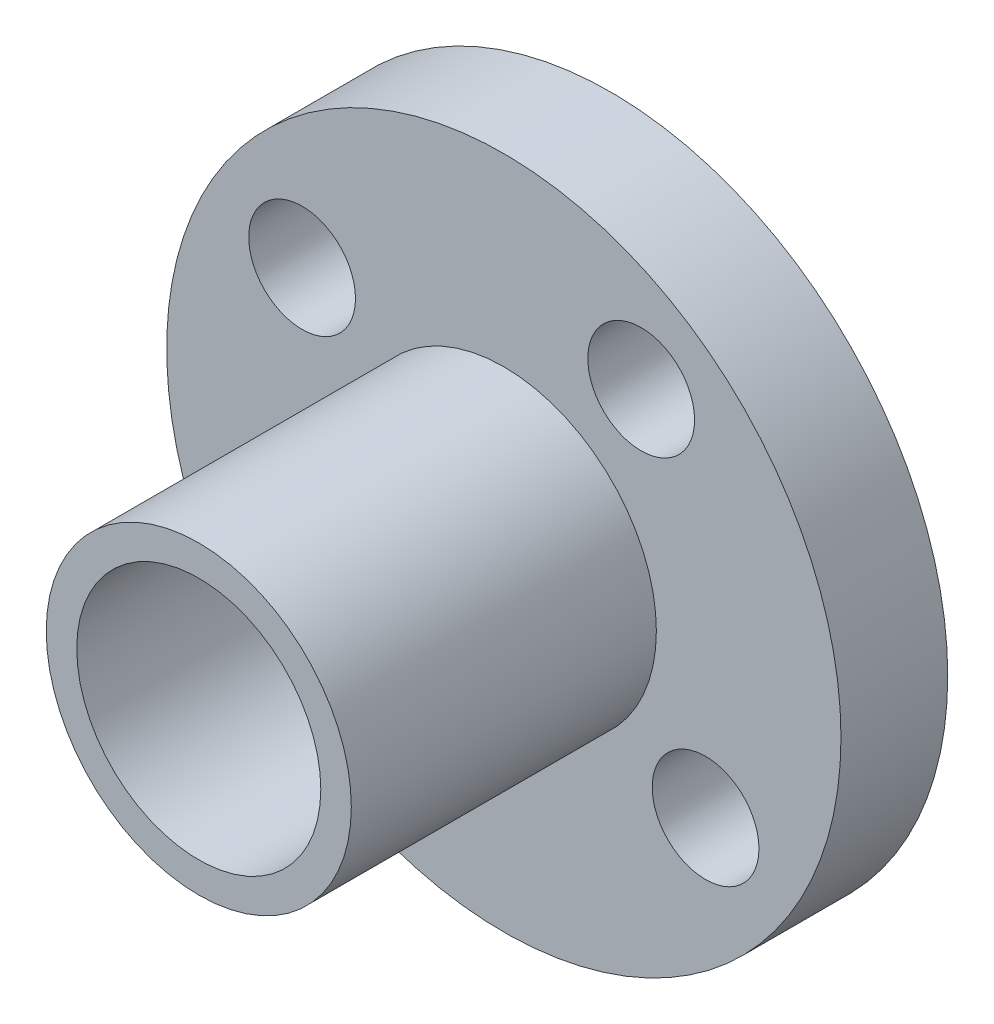
ISO-10303-21;
HEADER;
FILE_DESCRIPTION(('STEP AP214'),'2;1');
FILE_NAME('part.step','',(''),(''),'','','');
FILE_SCHEMA(('AUTOMOTIVE_DESIGN { 1 0 10303 214 1 1 1 1 }'));
ENDSEC;
DATA;
#1=APPLICATION_CONTEXT('core data for automotive mechanical design processes');
#2=APPLICATION_PROTOCOL_DEFINITION('international standard','automotive_design',2000,#1);
#3=PRODUCT_CONTEXT('',#1,'mechanical');
#4=PRODUCT('Part','Part','',(#3));
#5=PRODUCT_RELATED_PRODUCT_CATEGORY('part','',(#4));
#6=PRODUCT_DEFINITION_FORMATION('','',#4);
#7=PRODUCT_DEFINITION_CONTEXT('part definition',#1,'design');
#8=PRODUCT_DEFINITION('design','',#6,#7);
#9=PRODUCT_DEFINITION_SHAPE('','',#8);
#10=(LENGTH_UNIT() NAMED_UNIT(*) SI_UNIT(.MILLI.,.METRE.));
#11=(NAMED_UNIT(*) PLANE_ANGLE_UNIT() SI_UNIT($,.RADIAN.));
#12=(NAMED_UNIT(*) SI_UNIT($,.STERADIAN.) SOLID_ANGLE_UNIT());
#13=UNCERTAINTY_MEASURE_WITH_UNIT(LENGTH_MEASURE(1.E-05),#10,'distance_accuracy_value','');
#14=(GEOMETRIC_REPRESENTATION_CONTEXT(3) GLOBAL_UNCERTAINTY_ASSIGNED_CONTEXT((#13)) GLOBAL_UNIT_ASSIGNED_CONTEXT((#10,
#11,#12)) REPRESENTATION_CONTEXT('',''));
#15=CARTESIAN_POINT('',(0.,0.,0.));
#16=DIRECTION('',(0.,0.,1.));
#17=DIRECTION('',(1.,0.,0.));
#18=AXIS2_PLACEMENT_3D('',#15,#16,#17);
#19=CARTESIAN_POINT('',(-4.50200039763769,-6.61301689243798,3.5));
#20=DIRECTION('',(0.,0.,-1.));
#21=DIRECTION('',(-1.,0.,0.));
#22=AXIS2_PLACEMENT_3D('',#19,#20,#21);
#23=CYLINDRICAL_SURFACE('',#22,1.75);
#24=CARTESIAN_POINT('',(-4.50200039763769,-6.61301689243798,3.5));
#25=DIRECTION('',(0.,0.,1.));
#26=DIRECTION('',(1.,0.,0.));
#27=AXIS2_PLACEMENT_3D('',#24,#25,#26);
#28=CIRCLE('',#27,1.75);
#29=CARTESIAN_POINT('',(-2.75200039763769,-6.61301689243798,3.5));
#30=VERTEX_POINT('',#29);
#31=EDGE_CURVE('E44',#30,#30,#28,.T.);
#32=ORIENTED_EDGE('',*,*,#31,.T.);
#33=EDGE_LOOP('',(#32));
#34=FACE_BOUND('',#33,.T.);
#35=CARTESIAN_POINT('',(-4.50200039763769,-6.61301689243798,0.));
#36=DIRECTION('',(0.,0.,1.));
#37=DIRECTION('',(1.,0.,0.));
#38=AXIS2_PLACEMENT_3D('',#35,#36,#37);
#39=CIRCLE('',#38,1.75);
#40=CARTESIAN_POINT('',(-2.75200039763769,-6.61301689243798,0.));
#41=VERTEX_POINT('',#40);
#42=EDGE_CURVE('E62',#41,#41,#39,.T.);
#43=ORIENTED_EDGE('',*,*,#42,.F.);
#44=EDGE_LOOP('',(#43));
#45=FACE_BOUND('',#44,.T.);
#46=ADVANCED_FACE('F36',(#34,#45),#23,.F.);
#47=CARTESIAN_POINT('',(-6.61301689243796,4.50200039763772,3.5));
#48=DIRECTION('',(0.,0.,-1.));
#49=DIRECTION('',(-1.,0.,0.));
#50=AXIS2_PLACEMENT_3D('',#47,#48,#49);
#51=CYLINDRICAL_SURFACE('',#50,1.75);
#52=CARTESIAN_POINT('',(-6.61301689243796,4.50200039763772,3.5));
#53=DIRECTION('',(0.,0.,1.));
#54=DIRECTION('',(1.,0.,0.));
#55=AXIS2_PLACEMENT_3D('',#52,#53,#54);
#56=CIRCLE('',#55,1.75);
#57=CARTESIAN_POINT('',(-4.86301689243796,4.50200039763772,3.5));
#58=VERTEX_POINT('',#57);
#59=EDGE_CURVE('E49',#58,#58,#56,.T.);
#60=ORIENTED_EDGE('',*,*,#59,.T.);
#61=EDGE_LOOP('',(#60));
#62=FACE_BOUND('',#61,.T.);
#63=CARTESIAN_POINT('',(-6.61301689243796,4.50200039763772,0.));
#64=DIRECTION('',(0.,0.,1.));
#65=DIRECTION('',(1.,0.,0.));
#66=AXIS2_PLACEMENT_3D('',#63,#64,#65);
#67=CIRCLE('',#66,1.75);
#68=CARTESIAN_POINT('',(-4.86301689243796,4.50200039763772,0.));
#69=VERTEX_POINT('',#68);
#70=EDGE_CURVE('E60',#69,#69,#67,.T.);
#71=ORIENTED_EDGE('',*,*,#70,.F.);
#72=EDGE_LOOP('',(#71));
#73=FACE_BOUND('',#72,.T.);
#74=ADVANCED_FACE('F85',(#62,#73),#51,.F.);
#75=CARTESIAN_POINT('',(4.50200039763774,6.61301689243794,3.5));
#76=DIRECTION('',(0.,0.,-1.));
#77=DIRECTION('',(-1.,0.,0.));
#78=AXIS2_PLACEMENT_3D('',#75,#76,#77);
#79=CYLINDRICAL_SURFACE('',#78,1.75);
#80=CARTESIAN_POINT('',(4.50200039763774,6.61301689243794,3.5));
#81=DIRECTION('',(0.,0.,1.));
#82=DIRECTION('',(1.,0.,0.));
#83=AXIS2_PLACEMENT_3D('',#80,#81,#82);
#84=CIRCLE('',#83,1.75);
#85=CARTESIAN_POINT('',(6.25200039763774,6.61301689243794,3.5));
#86=VERTEX_POINT('',#85);
#87=EDGE_CURVE('E76',#86,#86,#84,.T.);
#88=ORIENTED_EDGE('',*,*,#87,.T.);
#89=EDGE_LOOP('',(#88));
#90=FACE_BOUND('',#89,.T.);
#91=CARTESIAN_POINT('',(4.50200039763774,6.61301689243794,0.));
#92=DIRECTION('',(0.,0.,1.));
#93=DIRECTION('',(1.,0.,0.));
#94=AXIS2_PLACEMENT_3D('',#91,#92,#93);
#95=CIRCLE('',#94,1.75);
#96=CARTESIAN_POINT('',(6.25200039763774,6.61301689243794,0.));
#97=VERTEX_POINT('',#96);
#98=EDGE_CURVE('E56',#97,#97,#95,.T.);
#99=ORIENTED_EDGE('',*,*,#98,.F.);
#100=EDGE_LOOP('',(#99));
#101=FACE_BOUND('',#100,.T.);
#102=ADVANCED_FACE('F103',(#90,#101),#79,.F.);
#103=CARTESIAN_POINT('',(6.61301689243793,-4.50200039763776,3.5));
#104=DIRECTION('',(0.,0.,-1.));
#105=DIRECTION('',(-1.,0.,0.));
#106=AXIS2_PLACEMENT_3D('',#103,#104,#105);
#107=CYLINDRICAL_SURFACE('',#106,1.75);
#108=CARTESIAN_POINT('',(6.61301689243793,-4.50200039763776,3.5));
#109=DIRECTION('',(0.,0.,1.));
#110=DIRECTION('',(1.,0.,0.));
#111=AXIS2_PLACEMENT_3D('',#108,#109,#110);
#112=CIRCLE('',#111,1.75);
#113=CARTESIAN_POINT('',(8.36301689243793,-4.50200039763776,3.5));
#114=VERTEX_POINT('',#113);
#115=EDGE_CURVE('E71',#114,#114,#112,.T.);
#116=ORIENTED_EDGE('',*,*,#115,.T.);
#117=EDGE_LOOP('',(#116));
#118=FACE_BOUND('',#117,.T.);
#119=CARTESIAN_POINT('',(6.61301689243793,-4.50200039763776,0.));
#120=DIRECTION('',(0.,0.,1.));
#121=DIRECTION('',(1.,0.,0.));
#122=AXIS2_PLACEMENT_3D('',#119,#120,#121);
#123=CIRCLE('',#122,1.75);
#124=CARTESIAN_POINT('',(8.36301689243793,-4.50200039763776,0.));
#125=VERTEX_POINT('',#124);
#126=EDGE_CURVE('E53',#125,#125,#123,.T.);
#127=ORIENTED_EDGE('',*,*,#126,.F.);
#128=EDGE_LOOP('',(#127));
#129=FACE_BOUND('',#128,.T.);
#130=ADVANCED_FACE('F38',(#118,#129),#107,.F.);
#131=CARTESIAN_POINT('',(0.,0.,3.5));
#132=DIRECTION('',(0.,0.,-1.));
#133=DIRECTION('',(-1.,0.,0.));
#134=AXIS2_PLACEMENT_3D('',#131,#132,#133);
#135=CYLINDRICAL_SURFACE('',#134,11.0515253533293);
#136=CARTESIAN_POINT('',(0.,0.,3.5));
#137=DIRECTION('',(0.,0.,1.));
#138=DIRECTION('',(1.,0.,0.));
#139=AXIS2_PLACEMENT_3D('',#136,#137,#138);
#140=CIRCLE('',#139,11.0515253533293);
#141=CARTESIAN_POINT('',(11.0515253533293,0.,3.5));
#142=VERTEX_POINT('',#141);
#143=EDGE_CURVE('E10',#142,#142,#140,.T.);
#144=ORIENTED_EDGE('',*,*,#143,.F.);
#145=EDGE_LOOP('',(#144));
#146=FACE_BOUND('',#145,.T.);
#147=CARTESIAN_POINT('',(0.,0.,0.));
#148=DIRECTION('',(0.,0.,1.));
#149=DIRECTION('',(1.,0.,0.));
#150=AXIS2_PLACEMENT_3D('',#147,#148,#149);
#151=CIRCLE('',#150,11.0515253533293);
#152=CARTESIAN_POINT('',(11.0515253533293,0.,0.));
#153=VERTEX_POINT('',#152);
#154=EDGE_CURVE('E40',#153,#153,#151,.T.);
#155=ORIENTED_EDGE('',*,*,#154,.T.);
#156=EDGE_LOOP('',(#155));
#157=FACE_BOUND('',#156,.T.);
#158=ADVANCED_FACE('F92',(#146,#157),#135,.T.);
#159=CARTESIAN_POINT('',(0.,0.,3.5));
#160=DIRECTION('',(0.,0.,1.));
#161=DIRECTION('',(1.,0.,0.));
#162=AXIS2_PLACEMENT_3D('',#159,#160,#161);
#163=PLANE('',#162);
#164=CARTESIAN_POINT('',(0.,0.,3.5));
#165=DIRECTION('',(0.,0.,1.));
#166=DIRECTION('',(1.,0.,0.));
#167=AXIS2_PLACEMENT_3D('',#164,#165,#166);
#168=CIRCLE('',#167,5.);
#169=CARTESIAN_POINT('',(5.,0.,3.5));
#170=VERTEX_POINT('',#169);
#171=EDGE_CURVE('E67',#170,#170,#168,.T.);
#172=ORIENTED_EDGE('',*,*,#171,.F.);
#173=EDGE_LOOP('',(#172));
#174=FACE_BOUND('',#173,.T.);
#175=ORIENTED_EDGE('',*,*,#115,.F.);
#176=EDGE_LOOP('',(#175));
#177=FACE_BOUND('',#176,.T.);
#178=ORIENTED_EDGE('',*,*,#87,.F.);
#179=EDGE_LOOP('',(#178));
#180=FACE_BOUND('',#179,.T.);
#181=ORIENTED_EDGE('',*,*,#59,.F.);
#182=EDGE_LOOP('',(#181));
#183=FACE_BOUND('',#182,.T.);
#184=ORIENTED_EDGE('',*,*,#31,.F.);
#185=EDGE_LOOP('',(#184));
#186=FACE_BOUND('',#185,.T.);
#187=ORIENTED_EDGE('',*,*,#143,.T.);
#188=EDGE_LOOP('',(#187));
#189=FACE_BOUND('',#188,.T.);
#190=ADVANCED_FACE('F88',(#174,#177,#180,#183,#186,#189),#163,.T.);
#191=CARTESIAN_POINT('',(0.,0.,0.));
#192=DIRECTION('',(0.,0.,1.));
#193=DIRECTION('',(1.,0.,0.));
#194=AXIS2_PLACEMENT_3D('',#191,#192,#193);
#195=PLANE('',#194);
#196=CARTESIAN_POINT('',(0.,0.,0.));
#197=DIRECTION('',(0.,0.,1.));
#198=DIRECTION('',(1.,0.,0.));
#199=AXIS2_PLACEMENT_3D('',#196,#197,#198);
#200=CIRCLE('',#199,5.);
#201=CARTESIAN_POINT('',(5.,0.,0.));
#202=VERTEX_POINT('',#201);
#203=EDGE_CURVE('E57',#202,#202,#200,.T.);
#204=ORIENTED_EDGE('',*,*,#203,.T.);
#205=EDGE_LOOP('',(#204));
#206=FACE_BOUND('',#205,.T.);
#207=ORIENTED_EDGE('',*,*,#126,.T.);
#208=EDGE_LOOP('',(#207));
#209=FACE_BOUND('',#208,.T.);
#210=ORIENTED_EDGE('',*,*,#98,.T.);
#211=EDGE_LOOP('',(#210));
#212=FACE_BOUND('',#211,.T.);
#213=ORIENTED_EDGE('',*,*,#70,.T.);
#214=EDGE_LOOP('',(#213));
#215=FACE_BOUND('',#214,.T.);
#216=ORIENTED_EDGE('',*,*,#42,.T.);
#217=EDGE_LOOP('',(#216));
#218=FACE_BOUND('',#217,.T.);
#219=ORIENTED_EDGE('',*,*,#154,.F.);
#220=EDGE_LOOP('',(#219));
#221=FACE_BOUND('',#220,.T.);
#222=ADVANCED_FACE('F91',(#206,#209,#212,#215,#218,#221),#195,.F.);
#223=CARTESIAN_POINT('',(0.,0.,-1.5));
#224=DIRECTION('',(0.,0.,1.));
#225=DIRECTION('',(1.,0.,0.));
#226=AXIS2_PLACEMENT_3D('',#223,#224,#225);
#227=CYLINDRICAL_SURFACE('',#226,5.);
#228=CARTESIAN_POINT('',(0.,0.,-1.5));
#229=DIRECTION('',(0.,0.,1.));
#230=DIRECTION('',(1.,0.,0.));
#231=AXIS2_PLACEMENT_3D('',#228,#229,#230);
#232=CIRCLE('',#231,5.);
#233=CARTESIAN_POINT('',(5.,0.,-1.5));
#234=VERTEX_POINT('',#233);
#235=EDGE_CURVE('E157',#234,#234,#232,.T.);
#236=ORIENTED_EDGE('',*,*,#235,.T.);
#237=EDGE_LOOP('',(#236));
#238=FACE_BOUND('',#237,.T.);
#239=ORIENTED_EDGE('',*,*,#203,.F.);
#240=EDGE_LOOP('',(#239));
#241=FACE_BOUND('',#240,.T.);
#242=ADVANCED_FACE('F119',(#238,#241),#227,.T.);
#243=CARTESIAN_POINT('',(0.,0.,-1.5));
#244=DIRECTION('',(0.,0.,1.));
#245=DIRECTION('',(1.,0.,0.));
#246=AXIS2_PLACEMENT_3D('',#243,#244,#245);
#247=CYLINDRICAL_SURFACE('',#246,4.);
#248=CARTESIAN_POINT('',(0.,0.,-1.5));
#249=DIRECTION('',(0.,0.,1.));
#250=DIRECTION('',(1.,0.,0.));
#251=AXIS2_PLACEMENT_3D('',#248,#249,#250);
#252=CIRCLE('',#251,4.);
#253=CARTESIAN_POINT('',(4.,0.,-1.5));
#254=VERTEX_POINT('',#253);
#255=EDGE_CURVE('E154',#254,#254,#252,.T.);
#256=ORIENTED_EDGE('',*,*,#255,.F.);
#257=EDGE_LOOP('',(#256));
#258=FACE_BOUND('',#257,.T.);
#259=CARTESIAN_POINT('',(0.,0.,13.5));
#260=DIRECTION('',(0.,0.,1.));
#261=DIRECTION('',(1.,0.,0.));
#262=AXIS2_PLACEMENT_3D('',#259,#260,#261);
#263=CIRCLE('',#262,4.);
#264=CARTESIAN_POINT('',(4.,0.,13.5));
#265=VERTEX_POINT('',#264);
#266=EDGE_CURVE('E149',#265,#265,#263,.T.);
#267=ORIENTED_EDGE('',*,*,#266,.T.);
#268=EDGE_LOOP('',(#267));
#269=FACE_BOUND('',#268,.T.);
#270=ADVANCED_FACE('F126',(#258,#269),#247,.F.);
#271=ORIENTED_EDGE('',*,*,#171,.T.);
#272=EDGE_LOOP('',(#271));
#273=FACE_BOUND('',#272,.T.);
#274=CARTESIAN_POINT('',(0.,0.,13.5));
#275=DIRECTION('',(0.,0.,1.));
#276=DIRECTION('',(1.,0.,0.));
#277=AXIS2_PLACEMENT_3D('',#274,#275,#276);
#278=CIRCLE('',#277,5.);
#279=CARTESIAN_POINT('',(5.,0.,13.5));
#280=VERTEX_POINT('',#279);
#281=EDGE_CURVE('E152',#280,#280,#278,.T.);
#282=ORIENTED_EDGE('',*,*,#281,.F.);
#283=EDGE_LOOP('',(#282));
#284=FACE_BOUND('',#283,.T.);
#285=ADVANCED_FACE('F129',(#273,#284),#227,.T.);
#286=CARTESIAN_POINT('',(0.,0.,-1.5));
#287=DIRECTION('',(0.,0.,1.));
#288=DIRECTION('',(1.,0.,0.));
#289=AXIS2_PLACEMENT_3D('',#286,#287,#288);
#290=PLANE('',#289);
#291=ORIENTED_EDGE('',*,*,#255,.T.);
#292=EDGE_LOOP('',(#291));
#293=FACE_BOUND('',#292,.T.);
#294=ORIENTED_EDGE('',*,*,#235,.F.);
#295=EDGE_LOOP('',(#294));
#296=FACE_BOUND('',#295,.T.);
#297=ADVANCED_FACE('F137',(#293,#296),#290,.F.);
#298=CARTESIAN_POINT('',(0.,0.,13.5));
#299=DIRECTION('',(0.,0.,1.));
#300=DIRECTION('',(1.,0.,0.));
#301=AXIS2_PLACEMENT_3D('',#298,#299,#300);
#302=PLANE('',#301);
#303=ORIENTED_EDGE('',*,*,#266,.F.);
#304=EDGE_LOOP('',(#303));
#305=FACE_BOUND('',#304,.T.);
#306=ORIENTED_EDGE('',*,*,#281,.T.);
#307=EDGE_LOOP('',(#306));
#308=FACE_BOUND('',#307,.T.);
#309=ADVANCED_FACE('F140',(#305,#308),#302,.T.);
#310=CLOSED_SHELL('',(#46,#74,#102,#130,#158,#190,#222,#242,#270,#285,#297,#309));
#311=MANIFOLD_SOLID_BREP('B2',#310);
#312=ADVANCED_BREP_SHAPE_REPRESENTATION('',(#18,#311),#14);
#313=SHAPE_DEFINITION_REPRESENTATION(#9,#312);
ENDSEC;
END-ISO-10303-21;
